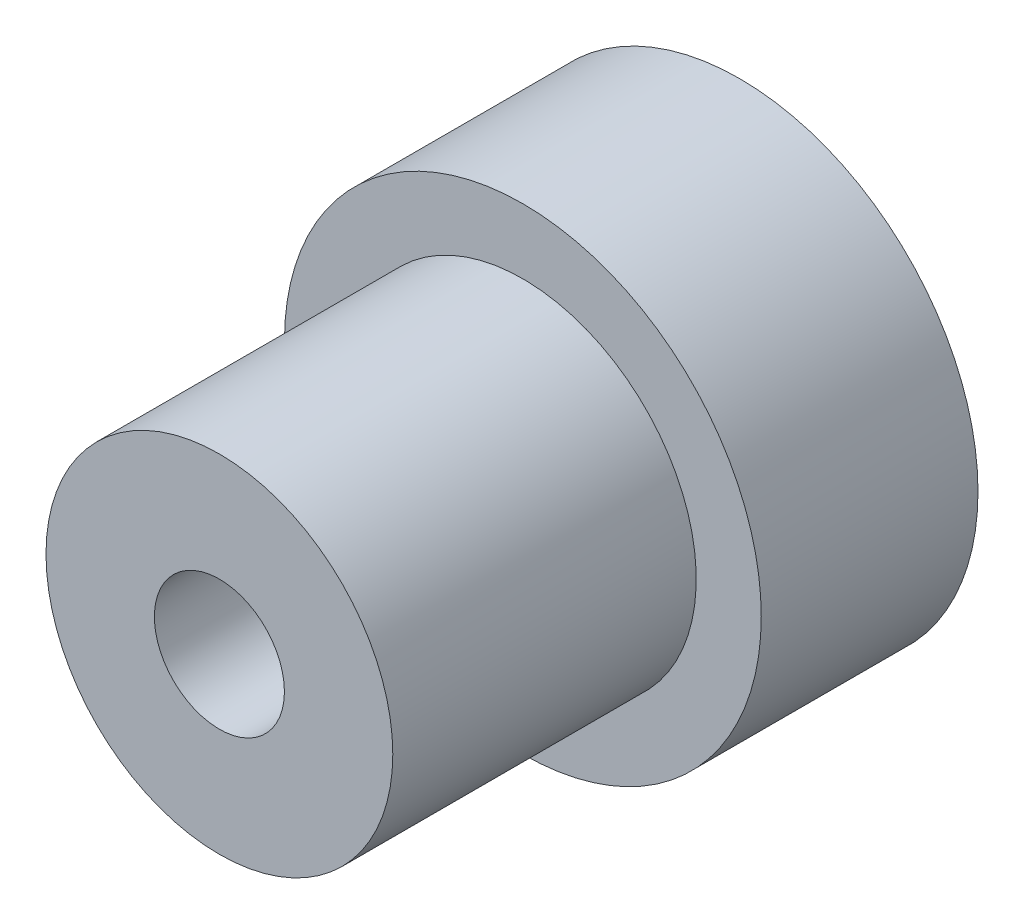
ISO-10303-21;
HEADER;
FILE_DESCRIPTION(('STEP AP214'),'2;1');
FILE_NAME('part.step','',(''),(''),'','','');
FILE_SCHEMA(('AUTOMOTIVE_DESIGN { 1 0 10303 214 1 1 1 1 }'));
ENDSEC;
DATA;
#1=APPLICATION_CONTEXT('core data for automotive mechanical design processes');
#2=APPLICATION_PROTOCOL_DEFINITION('international standard','automotive_design',2000,#1);
#3=PRODUCT_CONTEXT('',#1,'mechanical');
#4=PRODUCT('Part','Part','',(#3));
#5=PRODUCT_RELATED_PRODUCT_CATEGORY('part','',(#4));
#6=PRODUCT_DEFINITION_FORMATION('','',#4);
#7=PRODUCT_DEFINITION_CONTEXT('part definition',#1,'design');
#8=PRODUCT_DEFINITION('design','',#6,#7);
#9=PRODUCT_DEFINITION_SHAPE('','',#8);
#10=(LENGTH_UNIT() NAMED_UNIT(*) SI_UNIT(.MILLI.,.METRE.));
#11=(NAMED_UNIT(*) PLANE_ANGLE_UNIT() SI_UNIT($,.RADIAN.));
#12=(NAMED_UNIT(*) SI_UNIT($,.STERADIAN.) SOLID_ANGLE_UNIT());
#13=UNCERTAINTY_MEASURE_WITH_UNIT(LENGTH_MEASURE(1.E-05),#10,'distance_accuracy_value','');
#14=(GEOMETRIC_REPRESENTATION_CONTEXT(3) GLOBAL_UNCERTAINTY_ASSIGNED_CONTEXT((#13)) GLOBAL_UNIT_ASSIGNED_CONTEXT((#10,
#11,#12)) REPRESENTATION_CONTEXT('',''));
#15=CARTESIAN_POINT('',(0.,0.,0.));
#16=DIRECTION('',(0.,0.,1.));
#17=DIRECTION('',(1.,0.,0.));
#18=AXIS2_PLACEMENT_3D('',#15,#16,#17);
#19=CARTESIAN_POINT('',(0.,0.,12.));
#20=DIRECTION('',(0.,0.,-1.));
#21=DIRECTION('',(-1.,0.,0.));
#22=AXIS2_PLACEMENT_3D('',#19,#20,#21);
#23=CYLINDRICAL_SURFACE('',#22,4.);
#24=CARTESIAN_POINT('',(0.,0.,12.));
#25=DIRECTION('',(0.,0.,1.));
#26=DIRECTION('',(1.,0.,0.));
#27=AXIS2_PLACEMENT_3D('',#24,#25,#26);
#28=CIRCLE('',#27,4.);
#29=CARTESIAN_POINT('',(4.,0.,12.));
#30=VERTEX_POINT('',#29);
#31=EDGE_CURVE('E36',#30,#30,#28,.T.);
#32=ORIENTED_EDGE('',*,*,#31,.F.);
#33=EDGE_LOOP('',(#32));
#34=FACE_BOUND('',#33,.T.);
#35=CARTESIAN_POINT('',(0.,0.,5.));
#36=DIRECTION('',(0.,0.,-1.));
#37=DIRECTION('',(-1.,0.,0.));
#38=AXIS2_PLACEMENT_3D('',#35,#36,#37);
#39=CIRCLE('',#38,4.);
#40=CARTESIAN_POINT('',(-4.,0.,5.));
#41=VERTEX_POINT('',#40);
#42=EDGE_CURVE('E10',#41,#41,#39,.T.);
#43=ORIENTED_EDGE('',*,*,#42,.F.);
#44=EDGE_LOOP('',(#43));
#45=FACE_BOUND('',#44,.T.);
#46=ADVANCED_FACE('F29',(#34,#45),#23,.T.);
#47=CARTESIAN_POINT('',(0.,0.,12.));
#48=DIRECTION('',(0.,0.,1.));
#49=DIRECTION('',(1.,0.,0.));
#50=AXIS2_PLACEMENT_3D('',#47,#48,#49);
#51=PLANE('',#50);
#52=CARTESIAN_POINT('',(0.,0.,12.));
#53=DIRECTION('',(0.,0.,1.));
#54=DIRECTION('',(1.,0.,0.));
#55=AXIS2_PLACEMENT_3D('',#52,#53,#54);
#56=CIRCLE('',#55,1.5);
#57=CARTESIAN_POINT('',(1.5,0.,12.));
#58=VERTEX_POINT('',#57);
#59=EDGE_CURVE('E54',#58,#58,#56,.T.);
#60=ORIENTED_EDGE('',*,*,#59,.F.);
#61=EDGE_LOOP('',(#60));
#62=FACE_BOUND('',#61,.T.);
#63=ORIENTED_EDGE('',*,*,#31,.T.);
#64=EDGE_LOOP('',(#63));
#65=FACE_BOUND('',#64,.T.);
#66=ADVANCED_FACE('F88',(#62,#65),#51,.T.);
#67=CARTESIAN_POINT('',(0.,0.,5.));
#68=DIRECTION('',(0.,0.,-1.));
#69=DIRECTION('',(-1.,0.,0.));
#70=AXIS2_PLACEMENT_3D('',#67,#68,#69);
#71=PLANE('',#70);
#72=CARTESIAN_POINT('',(0.,0.,5.));
#73=DIRECTION('',(0.,0.,-1.));
#74=DIRECTION('',(-1.,0.,0.));
#75=AXIS2_PLACEMENT_3D('',#72,#73,#74);
#76=CIRCLE('',#75,5.5);
#77=CARTESIAN_POINT('',(-5.5,0.,5.));
#78=VERTEX_POINT('',#77);
#79=EDGE_CURVE('E40',#78,#78,#76,.T.);
#80=ORIENTED_EDGE('',*,*,#79,.F.);
#81=EDGE_LOOP('',(#80));
#82=FACE_BOUND('',#81,.T.);
#83=ORIENTED_EDGE('',*,*,#42,.T.);
#84=EDGE_LOOP('',(#83));
#85=FACE_BOUND('',#84,.T.);
#86=ADVANCED_FACE('F82',(#82,#85),#71,.F.);
#87=CARTESIAN_POINT('',(0.,0.,5.));
#88=DIRECTION('',(0.,0.,-1.));
#89=DIRECTION('',(-1.,0.,0.));
#90=AXIS2_PLACEMENT_3D('',#87,#88,#89);
#91=CYLINDRICAL_SURFACE('',#90,5.5);
#92=ORIENTED_EDGE('',*,*,#79,.T.);
#93=EDGE_LOOP('',(#92));
#94=FACE_BOUND('',#93,.T.);
#95=CARTESIAN_POINT('',(0.,0.,0.));
#96=DIRECTION('',(0.,0.,-1.));
#97=DIRECTION('',(-1.,0.,0.));
#98=AXIS2_PLACEMENT_3D('',#95,#96,#97);
#99=CIRCLE('',#98,5.5);
#100=CARTESIAN_POINT('',(-5.5,0.,0.));
#101=VERTEX_POINT('',#100);
#102=EDGE_CURVE('E43',#101,#101,#99,.T.);
#103=ORIENTED_EDGE('',*,*,#102,.F.);
#104=EDGE_LOOP('',(#103));
#105=FACE_BOUND('',#104,.T.);
#106=ADVANCED_FACE('F78',(#94,#105),#91,.T.);
#107=CARTESIAN_POINT('',(0.,0.,0.));
#108=DIRECTION('',(0.,0.,1.));
#109=DIRECTION('',(1.,0.,0.));
#110=AXIS2_PLACEMENT_3D('',#107,#108,#109);
#111=PLANE('',#110);
#112=CARTESIAN_POINT('',(0.,0.,0.));
#113=DIRECTION('',(0.,0.,-1.));
#114=DIRECTION('',(-1.,0.,0.));
#115=AXIS2_PLACEMENT_3D('',#112,#113,#114);
#116=CIRCLE('',#115,4.);
#117=CARTESIAN_POINT('',(-4.,0.,0.));
#118=VERTEX_POINT('',#117);
#119=EDGE_CURVE('E49',#118,#118,#116,.T.);
#120=ORIENTED_EDGE('',*,*,#119,.F.);
#121=EDGE_LOOP('',(#120));
#122=FACE_BOUND('',#121,.T.);
#123=ORIENTED_EDGE('',*,*,#102,.T.);
#124=EDGE_LOOP('',(#123));
#125=FACE_BOUND('',#124,.T.);
#126=ADVANCED_FACE('F72',(#122,#125),#111,.F.);
#127=CARTESIAN_POINT('',(0.,0.,2.));
#128=DIRECTION('',(0.,0.,-1.));
#129=DIRECTION('',(-1.,0.,0.));
#130=AXIS2_PLACEMENT_3D('',#127,#128,#129);
#131=CYLINDRICAL_SURFACE('',#130,4.);
#132=CARTESIAN_POINT('',(0.,0.,2.));
#133=DIRECTION('',(0.,0.,-1.));
#134=DIRECTION('',(-1.,0.,0.));
#135=AXIS2_PLACEMENT_3D('',#132,#133,#134);
#136=CIRCLE('',#135,4.);
#137=CARTESIAN_POINT('',(-4.,0.,2.));
#138=VERTEX_POINT('',#137);
#139=EDGE_CURVE('E46',#138,#138,#136,.T.);
#140=ORIENTED_EDGE('',*,*,#139,.F.);
#141=EDGE_LOOP('',(#140));
#142=FACE_BOUND('',#141,.T.);
#143=ORIENTED_EDGE('',*,*,#119,.T.);
#144=EDGE_LOOP('',(#143));
#145=FACE_BOUND('',#144,.T.);
#146=ADVANCED_FACE('F66',(#142,#145),#131,.F.);
#147=CARTESIAN_POINT('',(0.,0.,2.));
#148=DIRECTION('',(0.,0.,-1.));
#149=DIRECTION('',(-1.,0.,0.));
#150=AXIS2_PLACEMENT_3D('',#147,#148,#149);
#151=PLANE('',#150);
#152=CARTESIAN_POINT('',(0.,0.,2.));
#153=DIRECTION('',(0.,0.,-1.));
#154=DIRECTION('',(-1.,0.,0.));
#155=AXIS2_PLACEMENT_3D('',#152,#153,#154);
#156=CIRCLE('',#155,1.5);
#157=CARTESIAN_POINT('',(-1.5,0.,2.));
#158=VERTEX_POINT('',#157);
#159=EDGE_CURVE('E32',#158,#158,#156,.T.);
#160=ORIENTED_EDGE('',*,*,#159,.F.);
#161=EDGE_LOOP('',(#160));
#162=FACE_BOUND('',#161,.T.);
#163=ORIENTED_EDGE('',*,*,#139,.T.);
#164=EDGE_LOOP('',(#163));
#165=FACE_BOUND('',#164,.T.);
#166=ADVANCED_FACE('F63',(#162,#165),#151,.T.);
#167=CARTESIAN_POINT('',(0.,0.,0.));
#168=DIRECTION('',(0.,0.,1.));
#169=DIRECTION('',(1.,0.,0.));
#170=AXIS2_PLACEMENT_3D('',#167,#168,#169);
#171=CYLINDRICAL_SURFACE('',#170,1.5);
#172=ORIENTED_EDGE('',*,*,#159,.T.);
#173=EDGE_LOOP('',(#172));
#174=FACE_BOUND('',#173,.T.);
#175=ORIENTED_EDGE('',*,*,#59,.T.);
#176=EDGE_LOOP('',(#175));
#177=FACE_BOUND('',#176,.T.);
#178=ADVANCED_FACE('F61',(#174,#177),#171,.F.);
#179=CLOSED_SHELL('',(#46,#66,#86,#106,#126,#146,#166,#178));
#180=MANIFOLD_SOLID_BREP('B2',#179);
#181=ADVANCED_BREP_SHAPE_REPRESENTATION('',(#18,#180),#14);
#182=SHAPE_DEFINITION_REPRESENTATION(#9,#181);
ENDSEC;
END-ISO-10303-21;
